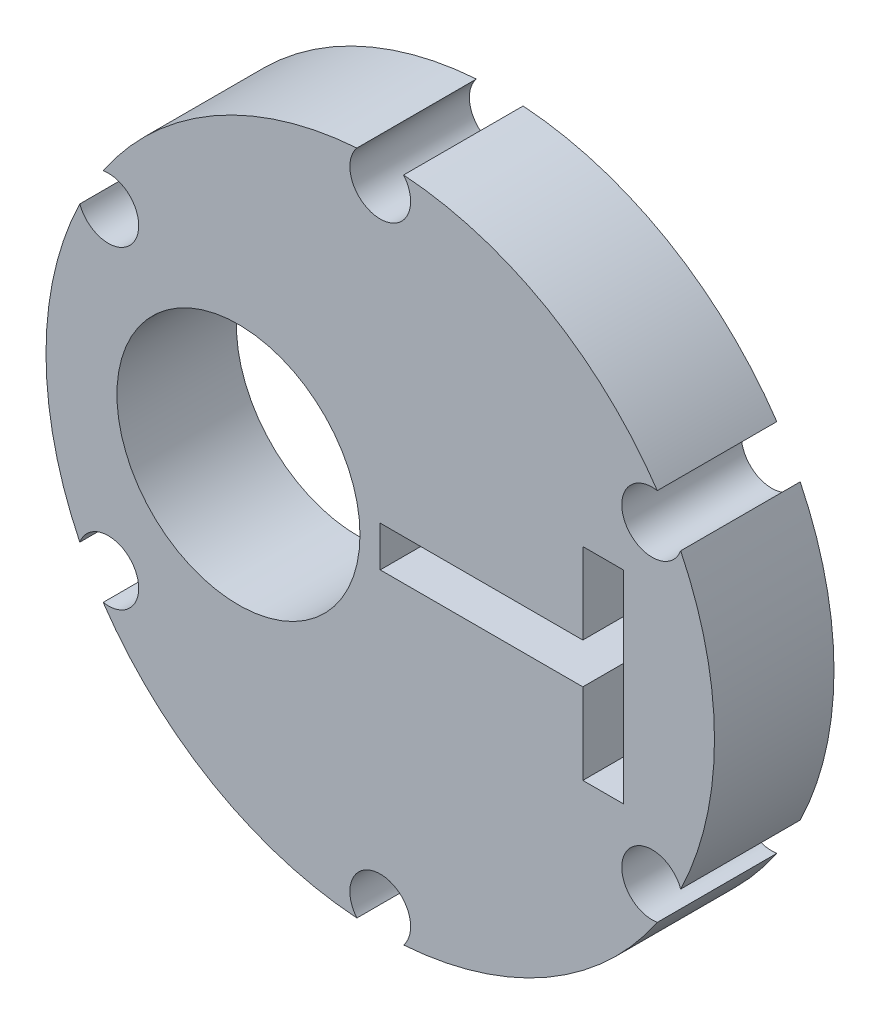
ISO-10303-21;
HEADER;
FILE_DESCRIPTION(('STEP AP214'),'2;1');
FILE_NAME('part.step','',(''),(''),'','','');
FILE_SCHEMA(('AUTOMOTIVE_DESIGN { 1 0 10303 214 1 1 1 1 }'));
ENDSEC;
DATA;
#1=APPLICATION_CONTEXT('core data for automotive mechanical design processes');
#2=APPLICATION_PROTOCOL_DEFINITION('international standard','automotive_design',2000,#1);
#3=PRODUCT_CONTEXT('',#1,'mechanical');
#4=PRODUCT('Part','Part','',(#3));
#5=PRODUCT_RELATED_PRODUCT_CATEGORY('part','',(#4));
#6=PRODUCT_DEFINITION_FORMATION('','',#4);
#7=PRODUCT_DEFINITION_CONTEXT('part definition',#1,'design');
#8=PRODUCT_DEFINITION('design','',#6,#7);
#9=PRODUCT_DEFINITION_SHAPE('','',#8);
#10=(LENGTH_UNIT() NAMED_UNIT(*) SI_UNIT(.MILLI.,.METRE.));
#11=(NAMED_UNIT(*) PLANE_ANGLE_UNIT() SI_UNIT($,.RADIAN.));
#12=(NAMED_UNIT(*) SI_UNIT($,.STERADIAN.) SOLID_ANGLE_UNIT());
#13=UNCERTAINTY_MEASURE_WITH_UNIT(LENGTH_MEASURE(1.E-05),#10,'distance_accuracy_value','');
#14=(GEOMETRIC_REPRESENTATION_CONTEXT(3) GLOBAL_UNCERTAINTY_ASSIGNED_CONTEXT((#13)) GLOBAL_UNIT_ASSIGNED_CONTEXT((#10,
#11,#12)) REPRESENTATION_CONTEXT('',''));
#15=CARTESIAN_POINT('',(0.,0.,0.));
#16=DIRECTION('',(0.,0.,1.));
#17=DIRECTION('',(1.,0.,0.));
#18=AXIS2_PLACEMENT_3D('',#15,#16,#17);
#19=CARTESIAN_POINT('',(0.,0.,5.9));
#20=DIRECTION('',(0.,0.,-1.));
#21=DIRECTION('',(-1.,0.,0.));
#22=AXIS2_PLACEMENT_3D('',#19,#20,#21);
#23=CYLINDRICAL_SURFACE('',#22,16.5);
#24=CARTESIAN_POINT('',(0.,0.,0.));
#25=DIRECTION('',(0.,0.,1.));
#26=DIRECTION('',(1.,0.,0.));
#27=AXIS2_PLACEMENT_3D('',#24,#25,#26);
#28=CIRCLE('',#27,16.5);
#29=CARTESIAN_POINT('',(14.8309142694271,-7.23145780136368,0.));
#30=VERTEX_POINT('',#29);
#31=CARTESIAN_POINT('',(14.8309142694271,7.23145780136372,0.));
#32=VERTEX_POINT('',#31);
#33=EDGE_CURVE('E330',#30,#32,#28,.T.);
#34=ORIENTED_EDGE('',*,*,#33,.T.);
#35=DIRECTION('',(0.,0.,1.));
#36=VECTOR('',#35,1.);
#37=CARTESIAN_POINT('',(14.8309142694271,7.23145780136372,2.95));
#38=LINE('',#37,#36);
#39=CARTESIAN_POINT('',(14.8309142694271,7.23145780136372,5.9));
#40=VERTEX_POINT('',#39);
#41=EDGE_CURVE('E287',#32,#40,#38,.T.);
#42=ORIENTED_EDGE('',*,*,#41,.T.);
#43=CARTESIAN_POINT('',(0.,0.,5.9));
#44=DIRECTION('',(0.,0.,1.));
#45=DIRECTION('',(1.,0.,0.));
#46=AXIS2_PLACEMENT_3D('',#43,#44,#45);
#47=CIRCLE('',#46,16.5);
#48=CARTESIAN_POINT('',(14.8309142694271,-7.23145780136368,5.9));
#49=VERTEX_POINT('',#48);
#50=EDGE_CURVE('E351',#49,#40,#47,.T.);
#51=ORIENTED_EDGE('',*,*,#50,.F.);
#52=DIRECTION('',(0.,0.,1.));
#53=VECTOR('',#52,1.);
#54=CARTESIAN_POINT('',(14.8309142694271,-7.23145780136368,2.95));
#55=LINE('',#54,#53);
#56=EDGE_CURVE('E278',#49,#30,#55,.F.);
#57=ORIENTED_EDGE('',*,*,#56,.T.);
#58=EDGE_LOOP('',(#34,#42,#51,#57));
#59=FACE_BOUND('',#58,.T.);
#60=ADVANCED_FACE('F33',(#59),#23,.T.);
#61=CARTESIAN_POINT('',(1.15283097233743,-16.4596774193548,0.));
#62=VERTEX_POINT('',#61);
#63=CARTESIAN_POINT('',(13.6780832970897,-9.22821961799116,0.));
#64=VERTEX_POINT('',#63);
#65=EDGE_CURVE('E327',#62,#64,#28,.T.);
#66=ORIENTED_EDGE('',*,*,#65,.T.);
#67=DIRECTION('',(0.,0.,1.));
#68=VECTOR('',#67,1.);
#69=CARTESIAN_POINT('',(13.6780832970897,-9.22821961799114,2.95));
#70=LINE('',#69,#68);
#71=CARTESIAN_POINT('',(13.6780832970897,-9.22821961799114,5.9));
#72=VERTEX_POINT('',#71);
#73=EDGE_CURVE('E281',#64,#72,#70,.T.);
#74=ORIENTED_EDGE('',*,*,#73,.T.);
#75=CARTESIAN_POINT('',(1.15283097233743,-16.4596774193548,5.9));
#76=VERTEX_POINT('',#75);
#77=EDGE_CURVE('E352',#76,#72,#47,.T.);
#78=ORIENTED_EDGE('',*,*,#77,.F.);
#79=DIRECTION('',(0.,0.,1.));
#80=VECTOR('',#79,1.);
#81=CARTESIAN_POINT('',(1.15283097233743,-16.4596774193548,2.95));
#82=LINE('',#81,#80);
#83=EDGE_CURVE('E272',#76,#62,#82,.F.);
#84=ORIENTED_EDGE('',*,*,#83,.T.);
#85=EDGE_LOOP('',(#66,#74,#78,#84));
#86=FACE_BOUND('',#85,.T.);
#87=ADVANCED_FACE('F375',(#86),#23,.T.);
#88=CARTESIAN_POINT('',(-13.6780832970896,-9.22821961799115,0.));
#89=VERTEX_POINT('',#88);
#90=CARTESIAN_POINT('',(-1.15283097233744,-16.4596774193548,0.));
#91=VERTEX_POINT('',#90);
#92=EDGE_CURVE('E321',#89,#91,#28,.T.);
#93=ORIENTED_EDGE('',*,*,#92,.T.);
#94=DIRECTION('',(0.,0.,1.));
#95=VECTOR('',#94,1.);
#96=CARTESIAN_POINT('',(-1.15283097233743,-16.4596774193548,2.95));
#97=LINE('',#96,#95);
#98=CARTESIAN_POINT('',(-1.15283097233743,-16.4596774193548,5.9));
#99=VERTEX_POINT('',#98);
#100=EDGE_CURVE('E275',#91,#99,#97,.T.);
#101=ORIENTED_EDGE('',*,*,#100,.T.);
#102=CARTESIAN_POINT('',(-13.6780832970896,-9.22821961799115,5.9));
#103=VERTEX_POINT('',#102);
#104=EDGE_CURVE('E356',#103,#99,#47,.T.);
#105=ORIENTED_EDGE('',*,*,#104,.F.);
#106=DIRECTION('',(0.,0.,1.));
#107=VECTOR('',#106,1.);
#108=CARTESIAN_POINT('',(-13.6780832970896,-9.22821961799115,2.95));
#109=LINE('',#108,#107);
#110=EDGE_CURVE('E266',#103,#89,#109,.F.);
#111=ORIENTED_EDGE('',*,*,#110,.T.);
#112=EDGE_LOOP('',(#93,#101,#105,#111));
#113=FACE_BOUND('',#112,.T.);
#114=ADVANCED_FACE('F379',(#113),#23,.T.);
#115=CARTESIAN_POINT('',(-14.8309142694271,7.23145780136367,0.));
#116=VERTEX_POINT('',#115);
#117=CARTESIAN_POINT('',(-14.8309142694271,-7.23145780136368,0.));
#118=VERTEX_POINT('',#117);
#119=EDGE_CURVE('E309',#116,#118,#28,.T.);
#120=ORIENTED_EDGE('',*,*,#119,.T.);
#121=DIRECTION('',(0.,0.,1.));
#122=VECTOR('',#121,1.);
#123=CARTESIAN_POINT('',(-14.8309142694271,-7.23145780136369,2.95));
#124=LINE('',#123,#122);
#125=CARTESIAN_POINT('',(-14.8309142694271,-7.23145780136369,5.9));
#126=VERTEX_POINT('',#125);
#127=EDGE_CURVE('E269',#118,#126,#124,.T.);
#128=ORIENTED_EDGE('',*,*,#127,.T.);
#129=CARTESIAN_POINT('',(-14.8309142694271,7.23145780136367,5.9));
#130=VERTEX_POINT('',#129);
#131=EDGE_CURVE('E304',#130,#126,#47,.T.);
#132=ORIENTED_EDGE('',*,*,#131,.F.);
#133=DIRECTION('',(0.,0.,1.));
#134=VECTOR('',#133,1.);
#135=CARTESIAN_POINT('',(-14.8309142694271,7.23145780136367,2.95));
#136=LINE('',#135,#134);
#137=EDGE_CURVE('E248',#130,#116,#136,.F.);
#138=ORIENTED_EDGE('',*,*,#137,.T.);
#139=EDGE_LOOP('',(#120,#128,#132,#138));
#140=FACE_BOUND('',#139,.T.);
#141=ADVANCED_FACE('F324',(#140),#23,.T.);
#142=CARTESIAN_POINT('',(-1.15283097233743,16.4596774193548,0.));
#143=VERTEX_POINT('',#142);
#144=CARTESIAN_POINT('',(-13.6780832970897,9.22821961799115,0.));
#145=VERTEX_POINT('',#144);
#146=EDGE_CURVE('E306',#143,#145,#28,.T.);
#147=ORIENTED_EDGE('',*,*,#146,.T.);
#148=DIRECTION('',(0.,0.,1.));
#149=VECTOR('',#148,1.);
#150=CARTESIAN_POINT('',(-13.6780832970897,9.22821961799113,2.95));
#151=LINE('',#150,#149);
#152=CARTESIAN_POINT('',(-13.6780832970897,9.22821961799113,5.9));
#153=VERTEX_POINT('',#152);
#154=EDGE_CURVE('E263',#145,#153,#151,.T.);
#155=ORIENTED_EDGE('',*,*,#154,.T.);
#156=CARTESIAN_POINT('',(-1.15283097233743,16.4596774193548,5.9));
#157=VERTEX_POINT('',#156);
#158=EDGE_CURVE('E300',#157,#153,#47,.T.);
#159=ORIENTED_EDGE('',*,*,#158,.F.);
#160=DIRECTION('',(0.,0.,1.));
#161=VECTOR('',#160,1.);
#162=CARTESIAN_POINT('',(-1.15283097233743,16.4596774193548,2.95));
#163=LINE('',#162,#161);
#164=EDGE_CURVE('E293',#157,#143,#163,.F.);
#165=ORIENTED_EDGE('',*,*,#164,.T.);
#166=EDGE_LOOP('',(#147,#155,#159,#165));
#167=FACE_BOUND('',#166,.T.);
#168=ADVANCED_FACE('F344',(#167),#23,.T.);
#169=CARTESIAN_POINT('',(13.6780832970897,9.22821961799114,5.9));
#170=VERTEX_POINT('',#169);
#171=CARTESIAN_POINT('',(1.15283097233743,16.4596774193548,5.9));
#172=VERTEX_POINT('',#171);
#173=EDGE_CURVE('E305',#170,#172,#47,.T.);
#174=ORIENTED_EDGE('',*,*,#173,.F.);
#175=DIRECTION('',(0.,0.,1.));
#176=VECTOR('',#175,1.);
#177=CARTESIAN_POINT('',(13.6780832970897,9.22821961799114,2.95));
#178=LINE('',#177,#176);
#179=CARTESIAN_POINT('',(13.6780832970897,9.22821961799114,0.));
#180=VERTEX_POINT('',#179);
#181=EDGE_CURVE('E284',#170,#180,#178,.F.);
#182=ORIENTED_EDGE('',*,*,#181,.T.);
#183=CARTESIAN_POINT('',(1.15283097233744,16.4596774193548,0.));
#184=VERTEX_POINT('',#183);
#185=EDGE_CURVE('E299',#180,#184,#28,.T.);
#186=ORIENTED_EDGE('',*,*,#185,.T.);
#187=DIRECTION('',(0.,0.,1.));
#188=VECTOR('',#187,1.);
#189=CARTESIAN_POINT('',(1.15283097233743,16.4596774193548,2.95));
#190=LINE('',#189,#188);
#191=EDGE_CURVE('E296',#184,#172,#190,.T.);
#192=ORIENTED_EDGE('',*,*,#191,.T.);
#193=EDGE_LOOP('',(#174,#182,#186,#192));
#194=FACE_BOUND('',#193,.T.);
#195=ADVANCED_FACE('F35',(#194),#23,.T.);
#196=CARTESIAN_POINT('',(0.,0.,5.9));
#197=DIRECTION('',(0.,0.,1.));
#198=DIRECTION('',(1.,0.,0.));
#199=AXIS2_PLACEMENT_3D('',#196,#197,#198);
#200=PLANE('',#199);
#201=DIRECTION('',(0.,1.,0.));
#202=VECTOR('',#201,1.);
#203=CARTESIAN_POINT('',(12.,5.,5.9));
#204=LINE('',#203,#202);
#205=CARTESIAN_POINT('',(12.,-5.,5.9));
#206=VERTEX_POINT('',#205);
#207=CARTESIAN_POINT('',(12.,5.,5.9));
#208=VERTEX_POINT('',#207);
#209=EDGE_CURVE('E48',#206,#208,#204,.T.);
#210=ORIENTED_EDGE('',*,*,#209,.F.);
#211=DIRECTION('',(1.,0.,0.));
#212=VECTOR('',#211,1.);
#213=CARTESIAN_POINT('',(12.,-5.,5.9));
#214=LINE('',#213,#212);
#215=CARTESIAN_POINT('',(10.,-5.,5.9));
#216=VERTEX_POINT('',#215);
#217=EDGE_CURVE('E189',#216,#206,#214,.T.);
#218=ORIENTED_EDGE('',*,*,#217,.F.);
#219=DIRECTION('',(0.,-1.,0.));
#220=VECTOR('',#219,1.);
#221=CARTESIAN_POINT('',(10.,-0.999999999999998,5.9));
#222=LINE('',#221,#220);
#223=CARTESIAN_POINT('',(10.,-0.999999999999998,5.9));
#224=VERTEX_POINT('',#223);
#225=EDGE_CURVE('E192',#224,#216,#222,.T.);
#226=ORIENTED_EDGE('',*,*,#225,.F.);
#227=DIRECTION('',(1.,0.,0.));
#228=VECTOR('',#227,1.);
#229=CARTESIAN_POINT('',(0.,-0.999999999999998,5.9));
#230=LINE('',#229,#228);
#231=CARTESIAN_POINT('',(0.,-0.999999999999998,5.9));
#232=VERTEX_POINT('',#231);
#233=EDGE_CURVE('E220',#232,#224,#230,.T.);
#234=ORIENTED_EDGE('',*,*,#233,.F.);
#235=DIRECTION('',(0.,-1.,0.));
#236=VECTOR('',#235,1.);
#237=CARTESIAN_POINT('',(0.,0.999999999999998,5.9));
#238=LINE('',#237,#236);
#239=CARTESIAN_POINT('',(0.,0.999999999999998,5.9));
#240=VERTEX_POINT('',#239);
#241=EDGE_CURVE('E217',#240,#232,#238,.T.);
#242=ORIENTED_EDGE('',*,*,#241,.F.);
#243=DIRECTION('',(-1.,0.,0.));
#244=VECTOR('',#243,1.);
#245=CARTESIAN_POINT('',(0.,0.999999999999998,5.9));
#246=LINE('',#245,#244);
#247=CARTESIAN_POINT('',(10.,0.999999999999998,5.9));
#248=VERTEX_POINT('',#247);
#249=EDGE_CURVE('E214',#248,#240,#246,.T.);
#250=ORIENTED_EDGE('',*,*,#249,.F.);
#251=DIRECTION('',(0.,-1.,0.));
#252=VECTOR('',#251,1.);
#253=CARTESIAN_POINT('',(10.,5.,5.9));
#254=LINE('',#253,#252);
#255=CARTESIAN_POINT('',(10.,5.,5.9));
#256=VERTEX_POINT('',#255);
#257=EDGE_CURVE('E211',#256,#248,#254,.T.);
#258=ORIENTED_EDGE('',*,*,#257,.F.);
#259=DIRECTION('',(-1.,0.,0.));
#260=VECTOR('',#259,1.);
#261=CARTESIAN_POINT('',(12.,5.,5.9));
#262=LINE('',#261,#260);
#263=EDGE_CURVE('E209',#208,#256,#262,.T.);
#264=ORIENTED_EDGE('',*,*,#263,.F.);
#265=EDGE_LOOP('',(#210,#218,#226,#234,#242,#250,#258,#264));
#266=FACE_BOUND('',#265,.T.);
#267=CARTESIAN_POINT('',(-7.,0.,5.9));
#268=DIRECTION('',(0.,0.,1.));
#269=DIRECTION('',(1.,0.,0.));
#270=AXIS2_PLACEMENT_3D('',#267,#268,#269);
#271=CIRCLE('',#270,6.);
#272=CARTESIAN_POINT('',(-0.999999999999999,0.,5.9));
#273=VERTEX_POINT('',#272);
#274=EDGE_CURVE('E227',#273,#273,#271,.T.);
#275=ORIENTED_EDGE('',*,*,#274,.F.);
#276=EDGE_LOOP('',(#275));
#277=FACE_BOUND('',#276,.T.);
#278=CARTESIAN_POINT('',(13.4233937586588,7.75,5.9));
#279=DIRECTION('',(0.,0.,1.));
#280=DIRECTION('',(1.,0.,0.));
#281=AXIS2_PLACEMENT_3D('',#278,#279,#280);
#282=CIRCLE('',#281,1.5);
#283=EDGE_CURVE('E249',#170,#40,#282,.T.);
#284=ORIENTED_EDGE('',*,*,#283,.F.);
#285=ORIENTED_EDGE('',*,*,#173,.T.);
#286=CARTESIAN_POINT('',(0.,15.5,5.9));
#287=DIRECTION('',(0.,0.,1.));
#288=DIRECTION('',(1.,0.,0.));
#289=AXIS2_PLACEMENT_3D('',#286,#287,#288);
#290=CIRCLE('',#289,1.5);
#291=EDGE_CURVE('E290',#157,#172,#290,.T.);
#292=ORIENTED_EDGE('',*,*,#291,.F.);
#293=ORIENTED_EDGE('',*,*,#158,.T.);
#294=CARTESIAN_POINT('',(-13.4233937586588,7.74999999999999,5.9));
#295=DIRECTION('',(0.,0.,1.));
#296=DIRECTION('',(1.,0.,0.));
#297=AXIS2_PLACEMENT_3D('',#294,#295,#296);
#298=CIRCLE('',#297,1.5);
#299=EDGE_CURVE('E242',#130,#153,#298,.T.);
#300=ORIENTED_EDGE('',*,*,#299,.F.);
#301=ORIENTED_EDGE('',*,*,#131,.T.);
#302=CARTESIAN_POINT('',(-13.4233937586588,-7.75000000000001,5.9));
#303=DIRECTION('',(0.,0.,1.));
#304=DIRECTION('',(1.,0.,0.));
#305=AXIS2_PLACEMENT_3D('',#302,#303,#304);
#306=CIRCLE('',#305,1.5);
#307=EDGE_CURVE('E258',#103,#126,#306,.T.);
#308=ORIENTED_EDGE('',*,*,#307,.F.);
#309=ORIENTED_EDGE('',*,*,#104,.T.);
#310=CARTESIAN_POINT('',(0.,-15.5,5.9));
#311=DIRECTION('',(0.,0.,1.));
#312=DIRECTION('',(1.,0.,0.));
#313=AXIS2_PLACEMENT_3D('',#310,#311,#312);
#314=CIRCLE('',#313,1.5);
#315=EDGE_CURVE('E256',#76,#99,#314,.T.);
#316=ORIENTED_EDGE('',*,*,#315,.F.);
#317=ORIENTED_EDGE('',*,*,#77,.T.);
#318=CARTESIAN_POINT('',(13.4233937586588,-7.75,5.9));
#319=DIRECTION('',(0.,0.,1.));
#320=DIRECTION('',(1.,0.,0.));
#321=AXIS2_PLACEMENT_3D('',#318,#319,#320);
#322=CIRCLE('',#321,1.5);
#323=EDGE_CURVE('E254',#49,#72,#322,.T.);
#324=ORIENTED_EDGE('',*,*,#323,.F.);
#325=ORIENTED_EDGE('',*,*,#50,.T.);
#326=EDGE_LOOP('',(#284,#285,#292,#293,#300,#301,#308,#309,#316,#317,#324,#325));
#327=FACE_BOUND('',#326,.T.);
#328=ADVANCED_FACE('F348',(#266,#277,#327),#200,.T.);
#329=CARTESIAN_POINT('',(0.,0.,0.));
#330=DIRECTION('',(0.,0.,1.));
#331=DIRECTION('',(1.,0.,0.));
#332=AXIS2_PLACEMENT_3D('',#329,#330,#331);
#333=PLANE('',#332);
#334=DIRECTION('',(1.,0.,0.));
#335=VECTOR('',#334,1.);
#336=CARTESIAN_POINT('',(12.,-5.,0.));
#337=LINE('',#336,#335);
#338=CARTESIAN_POINT('',(10.,-5.,0.));
#339=VERTEX_POINT('',#338);
#340=CARTESIAN_POINT('',(12.,-5.,0.));
#341=VERTEX_POINT('',#340);
#342=EDGE_CURVE('E178',#339,#341,#337,.T.);
#343=ORIENTED_EDGE('',*,*,#342,.T.);
#344=DIRECTION('',(0.,1.,0.));
#345=VECTOR('',#344,1.);
#346=CARTESIAN_POINT('',(12.,5.,0.));
#347=LINE('',#346,#345);
#348=CARTESIAN_POINT('',(12.,5.,0.));
#349=VERTEX_POINT('',#348);
#350=EDGE_CURVE('E172',#341,#349,#347,.T.);
#351=ORIENTED_EDGE('',*,*,#350,.T.);
#352=DIRECTION('',(-1.,0.,0.));
#353=VECTOR('',#352,1.);
#354=CARTESIAN_POINT('',(12.,5.,0.));
#355=LINE('',#354,#353);
#356=CARTESIAN_POINT('',(10.,5.,0.));
#357=VERTEX_POINT('',#356);
#358=EDGE_CURVE('E181',#349,#357,#355,.T.);
#359=ORIENTED_EDGE('',*,*,#358,.T.);
#360=DIRECTION('',(0.,-1.,0.));
#361=VECTOR('',#360,1.);
#362=CARTESIAN_POINT('',(10.,5.,0.));
#363=LINE('',#362,#361);
#364=CARTESIAN_POINT('',(10.,0.999999999999998,0.));
#365=VERTEX_POINT('',#364);
#366=EDGE_CURVE('E56',#357,#365,#363,.T.);
#367=ORIENTED_EDGE('',*,*,#366,.T.);
#368=DIRECTION('',(-1.,0.,0.));
#369=VECTOR('',#368,1.);
#370=CARTESIAN_POINT('',(0.,0.999999999999998,0.));
#371=LINE('',#370,#369);
#372=CARTESIAN_POINT('',(0.,0.999999999999998,0.));
#373=VERTEX_POINT('',#372);
#374=EDGE_CURVE('E196',#365,#373,#371,.T.);
#375=ORIENTED_EDGE('',*,*,#374,.T.);
#376=DIRECTION('',(0.,-1.,0.));
#377=VECTOR('',#376,1.);
#378=CARTESIAN_POINT('',(0.,0.999999999999998,0.));
#379=LINE('',#378,#377);
#380=CARTESIAN_POINT('',(0.,-0.999999999999998,0.));
#381=VERTEX_POINT('',#380);
#382=EDGE_CURVE('E199',#373,#381,#379,.T.);
#383=ORIENTED_EDGE('',*,*,#382,.T.);
#384=DIRECTION('',(1.,0.,0.));
#385=VECTOR('',#384,1.);
#386=CARTESIAN_POINT('',(0.,-0.999999999999998,0.));
#387=LINE('',#386,#385);
#388=CARTESIAN_POINT('',(10.,-0.999999999999998,0.));
#389=VERTEX_POINT('',#388);
#390=EDGE_CURVE('E202',#381,#389,#387,.T.);
#391=ORIENTED_EDGE('',*,*,#390,.T.);
#392=DIRECTION('',(0.,-1.,0.));
#393=VECTOR('',#392,1.);
#394=CARTESIAN_POINT('',(10.,-0.999999999999998,0.));
#395=LINE('',#394,#393);
#396=EDGE_CURVE('E205',#389,#339,#395,.T.);
#397=ORIENTED_EDGE('',*,*,#396,.T.);
#398=EDGE_LOOP('',(#343,#351,#359,#367,#375,#383,#391,#397));
#399=FACE_BOUND('',#398,.T.);
#400=CARTESIAN_POINT('',(-7.,0.,0.));
#401=DIRECTION('',(0.,0.,1.));
#402=DIRECTION('',(1.,0.,0.));
#403=AXIS2_PLACEMENT_3D('',#400,#401,#402);
#404=CIRCLE('',#403,6.);
#405=CARTESIAN_POINT('',(-0.999999999999999,0.,0.));
#406=VERTEX_POINT('',#405);
#407=EDGE_CURVE('E239',#406,#406,#404,.T.);
#408=ORIENTED_EDGE('',*,*,#407,.T.);
#409=EDGE_LOOP('',(#408));
#410=FACE_BOUND('',#409,.T.);
#411=ORIENTED_EDGE('',*,*,#185,.F.);
#412=CARTESIAN_POINT('',(13.4233937586588,7.75,0.));
#413=DIRECTION('',(0.,0.,1.));
#414=DIRECTION('',(1.,0.,0.));
#415=AXIS2_PLACEMENT_3D('',#412,#413,#414);
#416=CIRCLE('',#415,1.5);
#417=EDGE_CURVE('E245',#180,#32,#416,.T.);
#418=ORIENTED_EDGE('',*,*,#417,.T.);
#419=ORIENTED_EDGE('',*,*,#33,.F.);
#420=CARTESIAN_POINT('',(13.4233937586588,-7.75,0.));
#421=DIRECTION('',(0.,0.,1.));
#422=DIRECTION('',(1.,0.,0.));
#423=AXIS2_PLACEMENT_3D('',#420,#421,#422);
#424=CIRCLE('',#423,1.5);
#425=EDGE_CURVE('E251',#30,#64,#424,.T.);
#426=ORIENTED_EDGE('',*,*,#425,.T.);
#427=ORIENTED_EDGE('',*,*,#65,.F.);
#428=CARTESIAN_POINT('',(0.,-15.5,0.));
#429=DIRECTION('',(0.,0.,1.));
#430=DIRECTION('',(1.,0.,0.));
#431=AXIS2_PLACEMENT_3D('',#428,#429,#430);
#432=CIRCLE('',#431,1.5);
#433=EDGE_CURVE('E11',#62,#91,#432,.T.);
#434=ORIENTED_EDGE('',*,*,#433,.T.);
#435=ORIENTED_EDGE('',*,*,#92,.F.);
#436=CARTESIAN_POINT('',(-13.4233937586588,-7.75000000000001,0.));
#437=DIRECTION('',(0.,0.,1.));
#438=DIRECTION('',(1.,0.,0.));
#439=AXIS2_PLACEMENT_3D('',#436,#437,#438);
#440=CIRCLE('',#439,1.5);
#441=EDGE_CURVE('E41',#89,#118,#440,.T.);
#442=ORIENTED_EDGE('',*,*,#441,.T.);
#443=ORIENTED_EDGE('',*,*,#119,.F.);
#444=CARTESIAN_POINT('',(-13.4233937586588,7.74999999999999,0.));
#445=DIRECTION('',(0.,0.,1.));
#446=DIRECTION('',(1.,0.,0.));
#447=AXIS2_PLACEMENT_3D('',#444,#445,#446);
#448=CIRCLE('',#447,1.5);
#449=EDGE_CURVE('E312',#116,#145,#448,.T.);
#450=ORIENTED_EDGE('',*,*,#449,.T.);
#451=ORIENTED_EDGE('',*,*,#146,.F.);
#452=CARTESIAN_POINT('',(0.,15.5,0.));
#453=DIRECTION('',(0.,0.,1.));
#454=DIRECTION('',(1.,0.,0.));
#455=AXIS2_PLACEMENT_3D('',#452,#453,#454);
#456=CIRCLE('',#455,1.5);
#457=EDGE_CURVE('E303',#143,#184,#456,.T.);
#458=ORIENTED_EDGE('',*,*,#457,.T.);
#459=EDGE_LOOP('',(#411,#418,#419,#426,#427,#434,#435,#442,#443,#450,#451,#458));
#460=FACE_BOUND('',#459,.T.);
#461=ADVANCED_FACE('F185',(#399,#410,#460),#333,.F.);
#462=CARTESIAN_POINT('',(0.,15.5,0.));
#463=DIRECTION('',(0.,0.,1.));
#464=DIRECTION('',(1.,0.,0.));
#465=AXIS2_PLACEMENT_3D('',#462,#463,#464);
#466=CYLINDRICAL_SURFACE('',#465,1.5);
#467=ORIENTED_EDGE('',*,*,#457,.F.);
#468=ORIENTED_EDGE('',*,*,#164,.F.);
#469=ORIENTED_EDGE('',*,*,#291,.T.);
#470=ORIENTED_EDGE('',*,*,#191,.F.);
#471=EDGE_LOOP('',(#467,#468,#469,#470));
#472=FACE_BOUND('',#471,.T.);
#473=ADVANCED_FACE('F340',(#472),#466,.F.);
#474=CARTESIAN_POINT('',(-13.4233937586588,7.74999999999999,0.));
#475=DIRECTION('',(0.,0.,1.));
#476=DIRECTION('',(1.,0.,0.));
#477=AXIS2_PLACEMENT_3D('',#474,#475,#476);
#478=CYLINDRICAL_SURFACE('',#477,1.5);
#479=ORIENTED_EDGE('',*,*,#449,.F.);
#480=ORIENTED_EDGE('',*,*,#137,.F.);
#481=ORIENTED_EDGE('',*,*,#299,.T.);
#482=ORIENTED_EDGE('',*,*,#154,.F.);
#483=EDGE_LOOP('',(#479,#480,#481,#482));
#484=FACE_BOUND('',#483,.T.);
#485=ADVANCED_FACE('F363',(#484),#478,.F.);
#486=CARTESIAN_POINT('',(-13.4233937586588,-7.75000000000001,0.));
#487=DIRECTION('',(0.,0.,1.));
#488=DIRECTION('',(1.,0.,0.));
#489=AXIS2_PLACEMENT_3D('',#486,#487,#488);
#490=CYLINDRICAL_SURFACE('',#489,1.5);
#491=ORIENTED_EDGE('',*,*,#441,.F.);
#492=ORIENTED_EDGE('',*,*,#110,.F.);
#493=ORIENTED_EDGE('',*,*,#307,.T.);
#494=ORIENTED_EDGE('',*,*,#127,.F.);
#495=EDGE_LOOP('',(#491,#492,#493,#494));
#496=FACE_BOUND('',#495,.T.);
#497=ADVANCED_FACE('F365',(#496),#490,.F.);
#498=CARTESIAN_POINT('',(0.,-15.5,0.));
#499=DIRECTION('',(0.,0.,1.));
#500=DIRECTION('',(1.,0.,0.));
#501=AXIS2_PLACEMENT_3D('',#498,#499,#500);
#502=CYLINDRICAL_SURFACE('',#501,1.5);
#503=ORIENTED_EDGE('',*,*,#433,.F.);
#504=ORIENTED_EDGE('',*,*,#83,.F.);
#505=ORIENTED_EDGE('',*,*,#315,.T.);
#506=ORIENTED_EDGE('',*,*,#100,.F.);
#507=EDGE_LOOP('',(#503,#504,#505,#506));
#508=FACE_BOUND('',#507,.T.);
#509=ADVANCED_FACE('F371',(#508),#502,.F.);
#510=CARTESIAN_POINT('',(13.4233937586588,-7.75,0.));
#511=DIRECTION('',(0.,0.,1.));
#512=DIRECTION('',(1.,0.,0.));
#513=AXIS2_PLACEMENT_3D('',#510,#511,#512);
#514=CYLINDRICAL_SURFACE('',#513,1.5);
#515=ORIENTED_EDGE('',*,*,#425,.F.);
#516=ORIENTED_EDGE('',*,*,#56,.F.);
#517=ORIENTED_EDGE('',*,*,#323,.T.);
#518=ORIENTED_EDGE('',*,*,#73,.F.);
#519=EDGE_LOOP('',(#515,#516,#517,#518));
#520=FACE_BOUND('',#519,.T.);
#521=ADVANCED_FACE('F427',(#520),#514,.F.);
#522=CARTESIAN_POINT('',(13.4233937586588,7.75,0.));
#523=DIRECTION('',(0.,0.,1.));
#524=DIRECTION('',(1.,0.,0.));
#525=AXIS2_PLACEMENT_3D('',#522,#523,#524);
#526=CYLINDRICAL_SURFACE('',#525,1.5);
#527=ORIENTED_EDGE('',*,*,#417,.F.);
#528=ORIENTED_EDGE('',*,*,#181,.F.);
#529=ORIENTED_EDGE('',*,*,#283,.T.);
#530=ORIENTED_EDGE('',*,*,#41,.F.);
#531=EDGE_LOOP('',(#527,#528,#529,#530));
#532=FACE_BOUND('',#531,.T.);
#533=ADVANCED_FACE('F436',(#532),#526,.F.);
#534=CARTESIAN_POINT('',(-7.,0.,0.));
#535=DIRECTION('',(0.,0.,1.));
#536=DIRECTION('',(1.,0.,0.));
#537=AXIS2_PLACEMENT_3D('',#534,#535,#536);
#538=CYLINDRICAL_SURFACE('',#537,6.);
#539=ORIENTED_EDGE('',*,*,#407,.F.);
#540=EDGE_LOOP('',(#539));
#541=FACE_BOUND('',#540,.T.);
#542=ORIENTED_EDGE('',*,*,#274,.T.);
#543=EDGE_LOOP('',(#542));
#544=FACE_BOUND('',#543,.T.);
#545=ADVANCED_FACE('F445',(#541,#544),#538,.F.);
#546=CARTESIAN_POINT('',(12.,5.,0.));
#547=DIRECTION('',(1.,0.,0.));
#548=DIRECTION('',(0.,0.,-1.));
#549=AXIS2_PLACEMENT_3D('',#546,#547,#548);
#550=PLANE('',#549);
#551=ORIENTED_EDGE('',*,*,#209,.T.);
#552=DIRECTION('',(0.,0.,1.));
#553=VECTOR('',#552,1.);
#554=CARTESIAN_POINT('',(12.,5.,0.));
#555=LINE('',#554,#553);
#556=EDGE_CURVE('E168',#349,#208,#555,.T.);
#557=ORIENTED_EDGE('',*,*,#556,.F.);
#558=ORIENTED_EDGE('',*,*,#350,.F.);
#559=DIRECTION('',(0.,0.,1.));
#560=VECTOR('',#559,1.);
#561=CARTESIAN_POINT('',(12.,-5.,0.));
#562=LINE('',#561,#560);
#563=EDGE_CURVE('E225',#341,#206,#562,.T.);
#564=ORIENTED_EDGE('',*,*,#563,.T.);
#565=EDGE_LOOP('',(#551,#557,#558,#564));
#566=FACE_BOUND('',#565,.T.);
#567=ADVANCED_FACE('F170',(#566),#550,.F.);
#568=CARTESIAN_POINT('',(12.,-5.,0.));
#569=DIRECTION('',(0.,-1.,0.));
#570=DIRECTION('',(0.,0.,-1.));
#571=AXIS2_PLACEMENT_3D('',#568,#569,#570);
#572=PLANE('',#571);
#573=ORIENTED_EDGE('',*,*,#217,.T.);
#574=ORIENTED_EDGE('',*,*,#563,.F.);
#575=ORIENTED_EDGE('',*,*,#342,.F.);
#576=DIRECTION('',(0.,0.,1.));
#577=VECTOR('',#576,1.);
#578=CARTESIAN_POINT('',(10.,-5.,0.));
#579=LINE('',#578,#577);
#580=EDGE_CURVE('E228',#339,#216,#579,.T.);
#581=ORIENTED_EDGE('',*,*,#580,.T.);
#582=EDGE_LOOP('',(#573,#574,#575,#581));
#583=FACE_BOUND('',#582,.T.);
#584=ADVANCED_FACE('F463',(#583),#572,.F.);
#585=CARTESIAN_POINT('',(10.,-0.999999999999998,0.));
#586=DIRECTION('',(-1.,0.,0.));
#587=DIRECTION('',(0.,-1.,0.));
#588=AXIS2_PLACEMENT_3D('',#585,#586,#587);
#589=PLANE('',#588);
#590=ORIENTED_EDGE('',*,*,#225,.T.);
#591=ORIENTED_EDGE('',*,*,#580,.F.);
#592=ORIENTED_EDGE('',*,*,#396,.F.);
#593=DIRECTION('',(0.,0.,1.));
#594=VECTOR('',#593,1.);
#595=CARTESIAN_POINT('',(10.,-0.999999999999998,0.));
#596=LINE('',#595,#594);
#597=EDGE_CURVE('E230',#389,#224,#596,.T.);
#598=ORIENTED_EDGE('',*,*,#597,.T.);
#599=EDGE_LOOP('',(#590,#591,#592,#598));
#600=FACE_BOUND('',#599,.T.);
#601=ADVANCED_FACE('F472',(#600),#589,.F.);
#602=CARTESIAN_POINT('',(0.,-0.999999999999998,0.));
#603=DIRECTION('',(0.,-1.,0.));
#604=DIRECTION('',(0.,0.,-1.));
#605=AXIS2_PLACEMENT_3D('',#602,#603,#604);
#606=PLANE('',#605);
#607=ORIENTED_EDGE('',*,*,#233,.T.);
#608=ORIENTED_EDGE('',*,*,#597,.F.);
#609=ORIENTED_EDGE('',*,*,#390,.F.);
#610=DIRECTION('',(0.,0.,1.));
#611=VECTOR('',#610,1.);
#612=CARTESIAN_POINT('',(0.,-0.999999999999998,0.));
#613=LINE('',#612,#611);
#614=EDGE_CURVE('E232',#381,#232,#613,.T.);
#615=ORIENTED_EDGE('',*,*,#614,.T.);
#616=EDGE_LOOP('',(#607,#608,#609,#615));
#617=FACE_BOUND('',#616,.T.);
#618=ADVANCED_FACE('F481',(#617),#606,.F.);
#619=CARTESIAN_POINT('',(0.,0.999999999999998,0.));
#620=DIRECTION('',(-1.,0.,0.));
#621=DIRECTION('',(0.,-1.,0.));
#622=AXIS2_PLACEMENT_3D('',#619,#620,#621);
#623=PLANE('',#622);
#624=ORIENTED_EDGE('',*,*,#241,.T.);
#625=ORIENTED_EDGE('',*,*,#614,.F.);
#626=ORIENTED_EDGE('',*,*,#382,.F.);
#627=DIRECTION('',(0.,0.,1.));
#628=VECTOR('',#627,1.);
#629=CARTESIAN_POINT('',(0.,0.999999999999998,0.));
#630=LINE('',#629,#628);
#631=EDGE_CURVE('E234',#373,#240,#630,.T.);
#632=ORIENTED_EDGE('',*,*,#631,.T.);
#633=EDGE_LOOP('',(#624,#625,#626,#632));
#634=FACE_BOUND('',#633,.T.);
#635=ADVANCED_FACE('F490',(#634),#623,.F.);
#636=CARTESIAN_POINT('',(0.,0.999999999999998,0.));
#637=DIRECTION('',(0.,1.,0.));
#638=DIRECTION('',(0.,0.,1.));
#639=AXIS2_PLACEMENT_3D('',#636,#637,#638);
#640=PLANE('',#639);
#641=ORIENTED_EDGE('',*,*,#249,.T.);
#642=ORIENTED_EDGE('',*,*,#631,.F.);
#643=ORIENTED_EDGE('',*,*,#374,.F.);
#644=DIRECTION('',(0.,0.,1.));
#645=VECTOR('',#644,1.);
#646=CARTESIAN_POINT('',(10.,0.999999999999998,0.));
#647=LINE('',#646,#645);
#648=EDGE_CURVE('E236',#365,#248,#647,.T.);
#649=ORIENTED_EDGE('',*,*,#648,.T.);
#650=EDGE_LOOP('',(#641,#642,#643,#649));
#651=FACE_BOUND('',#650,.T.);
#652=ADVANCED_FACE('F499',(#651),#640,.F.);
#653=CARTESIAN_POINT('',(10.,5.,0.));
#654=DIRECTION('',(-1.,0.,0.));
#655=DIRECTION('',(0.,-1.,0.));
#656=AXIS2_PLACEMENT_3D('',#653,#654,#655);
#657=PLANE('',#656);
#658=ORIENTED_EDGE('',*,*,#257,.T.);
#659=ORIENTED_EDGE('',*,*,#648,.F.);
#660=ORIENTED_EDGE('',*,*,#366,.F.);
#661=DIRECTION('',(0.,0.,1.));
#662=VECTOR('',#661,1.);
#663=CARTESIAN_POINT('',(10.,5.,0.));
#664=LINE('',#663,#662);
#665=EDGE_CURVE('E177',#357,#256,#664,.T.);
#666=ORIENTED_EDGE('',*,*,#665,.T.);
#667=EDGE_LOOP('',(#658,#659,#660,#666));
#668=FACE_BOUND('',#667,.T.);
#669=ADVANCED_FACE('F508',(#668),#657,.F.);
#670=CARTESIAN_POINT('',(12.,5.,0.));
#671=DIRECTION('',(0.,1.,0.));
#672=DIRECTION('',(0.,0.,1.));
#673=AXIS2_PLACEMENT_3D('',#670,#671,#672);
#674=PLANE('',#673);
#675=ORIENTED_EDGE('',*,*,#263,.T.);
#676=ORIENTED_EDGE('',*,*,#665,.F.);
#677=ORIENTED_EDGE('',*,*,#358,.F.);
#678=ORIENTED_EDGE('',*,*,#556,.T.);
#679=EDGE_LOOP('',(#675,#676,#677,#678));
#680=FACE_BOUND('',#679,.T.);
#681=ADVANCED_FACE('F182',(#680),#674,.F.);
#682=CLOSED_SHELL('',(#60,#87,#114,#141,#168,#195,#328,#461,#473,#485,#497,#509,#521,#533,#545,
#567,#584,#601,#618,#635,#652,#669,#681));
#683=MANIFOLD_SOLID_BREP('B2',#682);
#684=ADVANCED_BREP_SHAPE_REPRESENTATION('',(#18,#683),#14);
#685=SHAPE_DEFINITION_REPRESENTATION(#9,#684);
ENDSEC;
END-ISO-10303-21;
